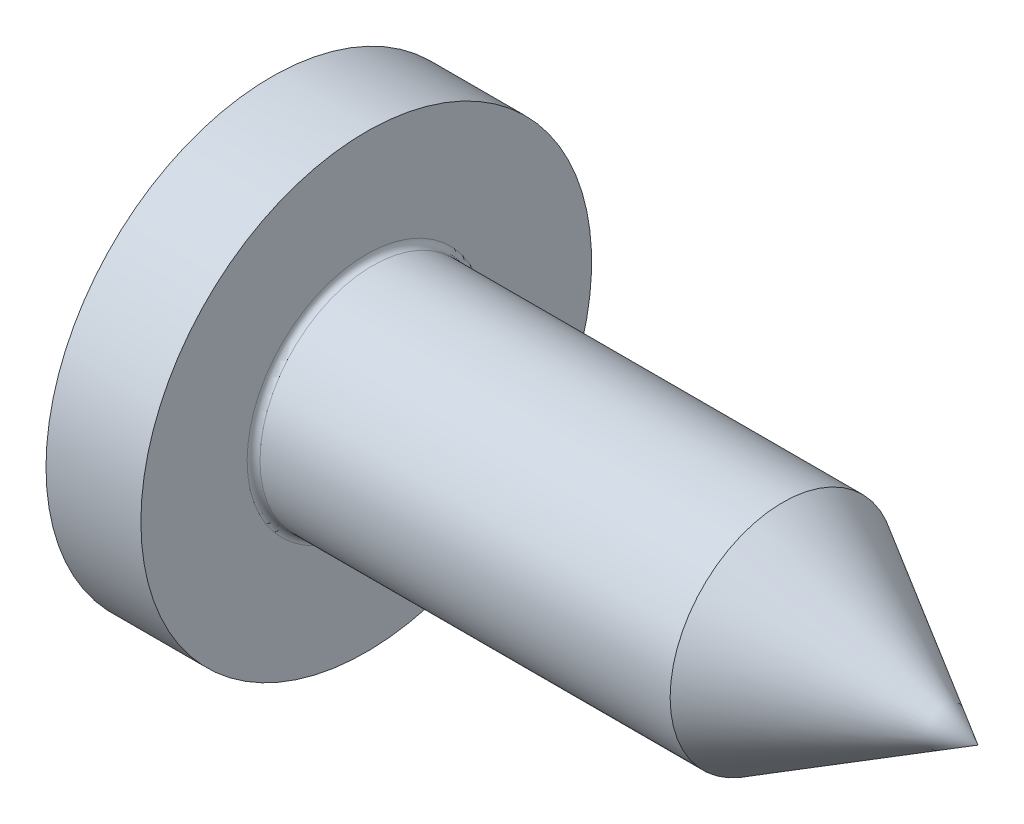
ISO-10303-21;
HEADER;
FILE_DESCRIPTION(('STEP AP214'),'2;1');
FILE_NAME('part.step','',(''),(''),'','','');
FILE_SCHEMA(('AUTOMOTIVE_DESIGN { 1 0 10303 214 1 1 1 1 }'));
ENDSEC;
DATA;
#1=APPLICATION_CONTEXT('core data for automotive mechanical design processes');
#2=APPLICATION_PROTOCOL_DEFINITION('international standard','automotive_design',2000,#1);
#3=PRODUCT_CONTEXT('',#1,'mechanical');
#4=PRODUCT('Part','Part','',(#3));
#5=PRODUCT_RELATED_PRODUCT_CATEGORY('part','',(#4));
#6=PRODUCT_DEFINITION_FORMATION('','',#4);
#7=PRODUCT_DEFINITION_CONTEXT('part definition',#1,'design');
#8=PRODUCT_DEFINITION('design','',#6,#7);
#9=PRODUCT_DEFINITION_SHAPE('','',#8);
#10=(LENGTH_UNIT() NAMED_UNIT(*) SI_UNIT(.MILLI.,.METRE.));
#11=(NAMED_UNIT(*) PLANE_ANGLE_UNIT() SI_UNIT($,.RADIAN.));
#12=(NAMED_UNIT(*) SI_UNIT($,.STERADIAN.) SOLID_ANGLE_UNIT());
#13=UNCERTAINTY_MEASURE_WITH_UNIT(LENGTH_MEASURE(1.E-05),#10,'distance_accuracy_value','');
#14=(GEOMETRIC_REPRESENTATION_CONTEXT(3) GLOBAL_UNCERTAINTY_ASSIGNED_CONTEXT((#13)) GLOBAL_UNIT_ASSIGNED_CONTEXT((#10,
#11,#12)) REPRESENTATION_CONTEXT('',''));
#15=CARTESIAN_POINT('',(0.,0.,0.));
#16=DIRECTION('',(0.,0.,1.));
#17=DIRECTION('',(1.,0.,0.));
#18=AXIS2_PLACEMENT_3D('',#15,#16,#17);
#19=CARTESIAN_POINT('',(3.4,0.,0.));
#20=DIRECTION('',(-1.,0.,0.));
#21=DIRECTION('',(0.,1.,0.));
#22=AXIS2_PLACEMENT_3D('',#19,#20,#21);
#23=SPHERICAL_SURFACE('',#22,6.);
#24=CARTESIAN_POINT('',(-1.47339717240448,0.,0.));
#25=DIRECTION('',(-1.,0.,0.));
#26=DIRECTION('',(0.,0.,1.));
#27=AXIS2_PLACEMENT_3D('',#24,#25,#26);
#28=CIRCLE('',#27,3.5);
#29=CARTESIAN_POINT('',(-1.47339717240448,0.,3.5));
#30=VERTEX_POINT('',#29);
#31=EDGE_CURVE('E197',#30,#30,#28,.T.);
#32=ORIENTED_EDGE('',*,*,#31,.T.);
#33=EDGE_LOOP('',(#32));
#34=FACE_BOUND('',#33,.T.);
#35=CARTESIAN_POINT('',(3.33444280220142,0.151277975654539,0.605111902618155));
#36=DIRECTION('',(0.104528463267654,-0.241206989505463,-0.964827958021851));
#37=DIRECTION('',(0.,0.970142500145332,-0.242535625036333));
#38=AXIS2_PLACEMENT_3D('',#35,#36,#37);
#39=CIRCLE('',#38,5.96713137220964);
#40=CARTESIAN_POINT('',(-2.26884904787776,1.91519463241969,-0.442922106386907));
#41=VERTEX_POINT('',#40);
#42=CARTESIAN_POINT('',(-2.47858837726631,1.16808862036956,-0.278868545434141));
#43=VERTEX_POINT('',#42);
#44=EDGE_CURVE('E330',#41,#43,#39,.F.);
#45=ORIENTED_EDGE('',*,*,#44,.F.);
#46=CARTESIAN_POINT('',(3.53715670074873,1.30495883826218,0.));
#47=DIRECTION('',(0.104528463267654,0.994521895368273,0.));
#48=DIRECTION('',(-0.994521895368273,0.104528463267654,0.));
#49=AXIS2_PLACEMENT_3D('',#46,#47,#48);
#50=CIRCLE('',#49,5.8547647664002);
#51=CARTESIAN_POINT('',(-2.26884904787776,1.91519463241969,0.442922106386907));
#52=VERTEX_POINT('',#51);
#53=EDGE_CURVE('E192',#52,#41,#50,.F.);
#54=ORIENTED_EDGE('',*,*,#53,.F.);
#55=CARTESIAN_POINT('',(3.33444280220142,0.151277975654539,-0.605111902618155));
#56=DIRECTION('',(0.104528463267654,-0.241206989505463,0.964827958021851));
#57=DIRECTION('',(0.,-0.970142500145332,-0.242535625036334));
#58=AXIS2_PLACEMENT_3D('',#55,#56,#57);
#59=CIRCLE('',#58,5.96713137220964);
#60=CARTESIAN_POINT('',(-2.47858837726631,1.16808862036956,0.27886854543414));
#61=VERTEX_POINT('',#60);
#62=EDGE_CURVE('E327',#61,#52,#59,.F.);
#63=ORIENTED_EDGE('',*,*,#62,.F.);
#64=CARTESIAN_POINT('',(3.42159027964193,0.10270889459097,0.1778970238208));
#65=DIRECTION('',(0.104528463267654,0.49726094768413,0.861281226008778));
#66=DIRECTION('',(0.,-0.866025403784442,0.499999999999993));
#67=AXIS2_PLACEMENT_3D('',#64,#65,#66);
#68=CIRCLE('',#67,5.9964437287206);
#69=CARTESIAN_POINT('',(-2.53788364639594,0.608907957684766,0.608907957684772));
#70=VERTEX_POINT('',#69);
#71=EDGE_CURVE('E325',#70,#61,#68,.F.);
#72=ORIENTED_EDGE('',*,*,#71,.F.);
#73=CARTESIAN_POINT('',(3.42159027964193,0.177897023820798,0.102708894590969));
#74=DIRECTION('',(0.104528463267654,0.861281226008778,0.49726094768413));
#75=DIRECTION('',(0.,-0.499999999999993,0.866025403784442));
#76=AXIS2_PLACEMENT_3D('',#73,#74,#75);
#77=CIRCLE('',#76,5.9964437287206);
#78=CARTESIAN_POINT('',(-2.47858837726631,0.278868545434134,1.16808862036956));
#79=VERTEX_POINT('',#78);
#80=EDGE_CURVE('E323',#79,#70,#77,.F.);
#81=ORIENTED_EDGE('',*,*,#80,.F.);
#82=CARTESIAN_POINT('',(3.33444280220142,-0.605111902618162,0.151277975654541));
#83=DIRECTION('',(0.104528463267654,0.964827958021851,-0.241206989505463));
#84=DIRECTION('',(0.,0.242535625036333,0.970142500145332));
#85=AXIS2_PLACEMENT_3D('',#82,#83,#84);
#86=CIRCLE('',#85,5.96713137220964);
#87=CARTESIAN_POINT('',(-2.26884904787776,0.442922106386901,1.9151946324197));
#88=VERTEX_POINT('',#87);
#89=EDGE_CURVE('E321',#88,#79,#86,.F.);
#90=ORIENTED_EDGE('',*,*,#89,.F.);
#91=CARTESIAN_POINT('',(3.53715670074873,0.,1.30495883826219));
#92=DIRECTION('',(0.104528463267654,0.,0.994521895368273));
#93=DIRECTION('',(0.994521895368273,0.,-0.104528463267654));
#94=AXIS2_PLACEMENT_3D('',#91,#92,#93);
#95=CIRCLE('',#94,5.8547647664002);
#96=CARTESIAN_POINT('',(-2.26884904787776,-0.442922106386913,1.9151946324197));
#97=VERTEX_POINT('',#96);
#98=EDGE_CURVE('E319',#97,#88,#95,.F.);
#99=ORIENTED_EDGE('',*,*,#98,.F.);
#100=CARTESIAN_POINT('',(3.33444280220142,0.605111902618151,0.151277975654538));
#101=DIRECTION('',(0.104528463267654,-0.964827958021851,-0.241206989505463));
#102=DIRECTION('',(0.,0.242535625036334,-0.970142500145332));
#103=AXIS2_PLACEMENT_3D('',#100,#101,#102);
#104=CIRCLE('',#103,5.96713137220964);
#105=CARTESIAN_POINT('',(-2.47858837726631,-0.278868545434147,1.16808862036956));
#106=VERTEX_POINT('',#105);
#107=EDGE_CURVE('E317',#106,#97,#104,.F.);
#108=ORIENTED_EDGE('',*,*,#107,.F.);
#109=CARTESIAN_POINT('',(3.42159027964194,-0.177897023820807,0.102708894590974));
#110=DIRECTION('',(0.104528463267654,-0.861281226008779,0.497260947684129));
#111=DIRECTION('',(0.,-0.499999999999992,-0.866025403784443));
#112=AXIS2_PLACEMENT_3D('',#109,#110,#111);
#113=CIRCLE('',#112,5.9964437287206);
#114=CARTESIAN_POINT('',(-2.53788364639594,-0.608907957684778,0.608907957684771));
#115=VERTEX_POINT('',#114);
#116=EDGE_CURVE('E315',#115,#106,#113,.F.);
#117=ORIENTED_EDGE('',*,*,#116,.F.);
#118=CARTESIAN_POINT('',(3.42159027964194,-0.102708894590973,0.177897023820804));
#119=DIRECTION('',(0.104528463267654,-0.497260947684129,0.861281226008779));
#120=DIRECTION('',(0.,-0.866025403784443,-0.499999999999992));
#121=AXIS2_PLACEMENT_3D('',#118,#119,#120);
#122=CIRCLE('',#121,5.9964437287206);
#123=CARTESIAN_POINT('',(-2.47858837726631,-1.16808862036957,0.27886854543414));
#124=VERTEX_POINT('',#123);
#125=EDGE_CURVE('E313',#124,#115,#122,.F.);
#126=ORIENTED_EDGE('',*,*,#125,.F.);
#127=CARTESIAN_POINT('',(3.33444280220142,-0.15127797565454,-0.605111902618158));
#128=DIRECTION('',(0.104528463267654,0.241206989505463,0.964827958021851));
#129=DIRECTION('',(0.,-0.970142500145332,0.242535625036333));
#130=AXIS2_PLACEMENT_3D('',#127,#128,#129);
#131=CIRCLE('',#130,5.96713137220964);
#132=CARTESIAN_POINT('',(-2.26884904787776,-1.9151946324197,0.442922106386907));
#133=VERTEX_POINT('',#132);
#134=EDGE_CURVE('E311',#133,#124,#131,.F.);
#135=ORIENTED_EDGE('',*,*,#134,.F.);
#136=CARTESIAN_POINT('',(3.53715670074873,-1.30495883826219,0.));
#137=DIRECTION('',(0.104528463267654,-0.994521895368273,0.));
#138=DIRECTION('',(0.994521895368273,0.104528463267654,0.));
#139=AXIS2_PLACEMENT_3D('',#136,#137,#138);
#140=CIRCLE('',#139,5.85476476640019);
#141=CARTESIAN_POINT('',(-2.26884904787775,-1.9151946324197,-0.442922106386907));
#142=VERTEX_POINT('',#141);
#143=EDGE_CURVE('E309',#142,#133,#140,.F.);
#144=ORIENTED_EDGE('',*,*,#143,.F.);
#145=CARTESIAN_POINT('',(3.33444280220142,-0.15127797565454,0.605111902618158));
#146=DIRECTION('',(0.104528463267654,0.241206989505463,-0.964827958021851));
#147=DIRECTION('',(0.,0.970142500145332,0.242535625036334));
#148=AXIS2_PLACEMENT_3D('',#145,#146,#147);
#149=CIRCLE('',#148,5.96713137220964);
#150=CARTESIAN_POINT('',(-2.47858837726631,-1.16808862036957,-0.27886854543414));
#151=VERTEX_POINT('',#150);
#152=EDGE_CURVE('E307',#151,#142,#149,.F.);
#153=ORIENTED_EDGE('',*,*,#152,.F.);
#154=CARTESIAN_POINT('',(3.42159027964194,-0.102708894590973,-0.177897023820805));
#155=DIRECTION('',(0.104528463267654,-0.49726094768413,-0.861281226008778));
#156=DIRECTION('',(0.,0.866025403784442,-0.499999999999993));
#157=AXIS2_PLACEMENT_3D('',#154,#155,#156);
#158=CIRCLE('',#157,5.9964437287206);
#159=CARTESIAN_POINT('',(-2.53788364639594,-0.608907957684778,-0.608907957684772));
#160=VERTEX_POINT('',#159);
#161=EDGE_CURVE('E305',#160,#151,#158,.F.);
#162=ORIENTED_EDGE('',*,*,#161,.F.);
#163=CARTESIAN_POINT('',(3.42159027964194,-0.177897023820807,-0.102708894590974));
#164=DIRECTION('',(0.104528463267654,-0.861281226008778,-0.49726094768413));
#165=DIRECTION('',(0.,0.499999999999993,-0.866025403784443));
#166=AXIS2_PLACEMENT_3D('',#163,#164,#165);
#167=CIRCLE('',#166,5.9964437287206);
#168=CARTESIAN_POINT('',(-2.47858837726631,-0.278868545434147,-1.16808862036956));
#169=VERTEX_POINT('',#168);
#170=EDGE_CURVE('E303',#169,#160,#167,.F.);
#171=ORIENTED_EDGE('',*,*,#170,.F.);
#172=CARTESIAN_POINT('',(3.33444280220142,0.60511190261815,-0.151277975654538));
#173=DIRECTION('',(0.104528463267654,-0.964827958021851,0.241206989505463));
#174=DIRECTION('',(0.,-0.242535625036333,-0.970142500145332));
#175=AXIS2_PLACEMENT_3D('',#172,#173,#174);
#176=CIRCLE('',#175,5.96713137220964);
#177=CARTESIAN_POINT('',(-2.26884904787776,-0.442922106386913,-1.9151946324197));
#178=VERTEX_POINT('',#177);
#179=EDGE_CURVE('E301',#178,#169,#176,.F.);
#180=ORIENTED_EDGE('',*,*,#179,.F.);
#181=CARTESIAN_POINT('',(3.53715670074873,0.,-1.30495883826219));
#182=DIRECTION('',(0.104528463267654,0.,-0.994521895368273));
#183=DIRECTION('',(-0.994521895368273,0.,-0.104528463267654));
#184=AXIS2_PLACEMENT_3D('',#181,#182,#183);
#185=CIRCLE('',#184,5.8547647664002);
#186=CARTESIAN_POINT('',(-2.26884904787776,0.442922106386901,-1.9151946324197));
#187=VERTEX_POINT('',#186);
#188=EDGE_CURVE('E299',#187,#178,#185,.F.);
#189=ORIENTED_EDGE('',*,*,#188,.F.);
#190=CARTESIAN_POINT('',(3.33444280220142,-0.605111902618163,-0.151277975654541));
#191=DIRECTION('',(0.104528463267654,0.964827958021851,0.241206989505463));
#192=DIRECTION('',(0.,-0.242535625036334,0.970142500145332));
#193=AXIS2_PLACEMENT_3D('',#190,#191,#192);
#194=CIRCLE('',#193,5.96713137220964);
#195=CARTESIAN_POINT('',(-2.47858837726631,0.278868545434134,-1.16808862036956));
#196=VERTEX_POINT('',#195);
#197=EDGE_CURVE('E297',#196,#187,#194,.F.);
#198=ORIENTED_EDGE('',*,*,#197,.F.);
#199=CARTESIAN_POINT('',(3.42159027964193,0.177897023820798,-0.102708894590969));
#200=DIRECTION('',(0.104528463267654,0.861281226008778,-0.49726094768413));
#201=DIRECTION('',(0.,0.499999999999993,0.866025403784442));
#202=AXIS2_PLACEMENT_3D('',#199,#200,#201);
#203=CIRCLE('',#202,5.9964437287206);
#204=CARTESIAN_POINT('',(-2.53788364639594,0.608907957684766,-0.608907957684772));
#205=VERTEX_POINT('',#204);
#206=EDGE_CURVE('E295',#205,#196,#203,.F.);
#207=ORIENTED_EDGE('',*,*,#206,.F.);
#208=CARTESIAN_POINT('',(3.42159027964193,0.10270889459097,-0.1778970238208));
#209=DIRECTION('',(0.104528463267654,0.49726094768413,-0.861281226008778));
#210=DIRECTION('',(0.,0.866025403784443,0.499999999999993));
#211=AXIS2_PLACEMENT_3D('',#208,#209,#210);
#212=CIRCLE('',#211,5.9964437287206);
#213=EDGE_CURVE('E293',#43,#205,#212,.F.);
#214=ORIENTED_EDGE('',*,*,#213,.F.);
#215=EDGE_LOOP('',(#45,#54,#63,#72,#81,#90,#99,#108,#117,#126,#135,#144,#153,#162,#171,#180,
#189,#198,#207,#214));
#216=FACE_BOUND('',#215,.T.);
#217=ADVANCED_FACE('F35',(#34,#216),#23,.T.);
#218=CARTESIAN_POINT('',(0.,0.,0.));
#219=DIRECTION('',(-1.,0.,0.));
#220=DIRECTION('',(0.,0.,1.));
#221=AXIS2_PLACEMENT_3D('',#218,#219,#220);
#222=CYLINDRICAL_SURFACE('',#221,1.75);
#223=CARTESIAN_POINT('',(0.1,0.,0.));
#224=DIRECTION('',(-1.,0.,0.));
#225=DIRECTION('',(0.,0.,1.));
#226=AXIS2_PLACEMENT_3D('',#223,#224,#225);
#227=CIRCLE('',#226,1.75);
#228=CARTESIAN_POINT('',(0.1,0.,1.75));
#229=VERTEX_POINT('',#228);
#230=EDGE_CURVE('E11',#229,#229,#227,.F.);
#231=ORIENTED_EDGE('',*,*,#230,.T.);
#232=EDGE_LOOP('',(#231));
#233=FACE_BOUND('',#232,.T.);
#234=CARTESIAN_POINT('',(6.46891108675442,0.,0.));
#235=DIRECTION('',(-1.,0.,0.));
#236=DIRECTION('',(0.,0.,1.));
#237=AXIS2_PLACEMENT_3D('',#234,#235,#236);
#238=CIRCLE('',#237,1.75);
#239=CARTESIAN_POINT('',(6.46891108675442,0.,1.75));
#240=VERTEX_POINT('',#239);
#241=EDGE_CURVE('E193',#240,#240,#238,.T.);
#242=ORIENTED_EDGE('',*,*,#241,.T.);
#243=EDGE_LOOP('',(#242));
#244=FACE_BOUND('',#243,.T.);
#245=ADVANCED_FACE('F346',(#233,#244),#222,.T.);
#246=CARTESIAN_POINT('',(0.,1.75,0.));
#247=DIRECTION('',(-1.,0.,0.));
#248=DIRECTION('',(0.,0.,1.));
#249=AXIS2_PLACEMENT_3D('',#246,#247,#248);
#250=PLANE('',#249);
#251=CARTESIAN_POINT('',(0.,0.,0.));
#252=DIRECTION('',(-1.,0.,0.));
#253=DIRECTION('',(0.,0.,1.));
#254=AXIS2_PLACEMENT_3D('',#251,#252,#253);
#255=CIRCLE('',#254,1.85);
#256=CARTESIAN_POINT('',(0.,0.,1.85));
#257=VERTEX_POINT('',#256);
#258=EDGE_CURVE('E43',#257,#257,#255,.T.);
#259=ORIENTED_EDGE('',*,*,#258,.T.);
#260=EDGE_LOOP('',(#259));
#261=FACE_BOUND('',#260,.T.);
#262=CARTESIAN_POINT('',(0.,0.,0.));
#263=DIRECTION('',(-1.,0.,0.));
#264=DIRECTION('',(0.,0.,1.));
#265=AXIS2_PLACEMENT_3D('',#262,#263,#264);
#266=CIRCLE('',#265,3.5);
#267=CARTESIAN_POINT('',(0.,0.,3.5));
#268=VERTEX_POINT('',#267);
#269=EDGE_CURVE('E290',#268,#268,#266,.T.);
#270=ORIENTED_EDGE('',*,*,#269,.F.);
#271=EDGE_LOOP('',(#270));
#272=FACE_BOUND('',#271,.T.);
#273=ADVANCED_FACE('F334',(#261,#272),#250,.F.);
#274=CARTESIAN_POINT('',(0.,0.,0.));
#275=DIRECTION('',(-1.,0.,0.));
#276=DIRECTION('',(0.,0.,1.));
#277=AXIS2_PLACEMENT_3D('',#274,#275,#276);
#278=CYLINDRICAL_SURFACE('',#277,3.5);
#279=ORIENTED_EDGE('',*,*,#31,.F.);
#280=EDGE_LOOP('',(#279));
#281=FACE_BOUND('',#280,.T.);
#282=ORIENTED_EDGE('',*,*,#269,.T.);
#283=EDGE_LOOP('',(#282));
#284=FACE_BOUND('',#283,.T.);
#285=ADVANCED_FACE('F357',(#281,#284),#278,.T.);
#286=CARTESIAN_POINT('',(6.46891108675442,0.,0.));
#287=DIRECTION('',(-1.,0.,0.));
#288=DIRECTION('',(0.,0.,1.));
#289=AXIS2_PLACEMENT_3D('',#286,#287,#288);
#290=CONICAL_SURFACE('',#289,1.75,0.523598775598293);
#291=CARTESIAN_POINT('',(9.5,0.,0.));
#292=VERTEX_POINT('',#291);
#293=VERTEX_LOOP('',#292);
#294=FACE_BOUND('',#293,.T.);
#295=ORIENTED_EDGE('',*,*,#241,.F.);
#296=EDGE_LOOP('',(#295));
#297=FACE_BOUND('',#296,.T.);
#298=ADVANCED_FACE('F359',(#294,#297),#290,.T.);
#299=CARTESIAN_POINT('',(-2.6,1.95,-0.4875));
#300=DIRECTION('',(0.104528463267654,-0.241206989505463,-0.964827958021851));
#301=DIRECTION('',(0.,0.970142500145332,-0.242535625036333));
#302=AXIS2_PLACEMENT_3D('',#299,#300,#301);
#303=PLANE('',#302);
#304=ORIENTED_EDGE('',*,*,#44,.T.);
#305=DIRECTION('',(-0.993634572314886,0.0156427600493606,-0.111560032084303));
#306=VECTOR('',#305,1.);
#307=CARTESIAN_POINT('',(-2.6,1.17,-0.2925));
#308=LINE('',#307,#306);
#309=CARTESIAN_POINT('',(-1.2,1.14795984089192,-0.135315407927927));
#310=VERTEX_POINT('',#309);
#311=EDGE_CURVE('E50',#310,#43,#308,.T.);
#312=ORIENTED_EDGE('',*,*,#311,.F.);
#313=DIRECTION('',(0.,-0.970142500145332,0.242535625036333));
#314=VECTOR('',#313,1.);
#315=CARTESIAN_POINT('',(-1.2,0.0356881299517736,0.142752519807111));
#316=LINE('',#315,#314);
#317=CARTESIAN_POINT('',(-1.2,1.80285407062805,-0.299038965361959));
#318=VERTEX_POINT('',#317);
#319=EDGE_CURVE('E176',#310,#318,#316,.F.);
#320=ORIENTED_EDGE('',*,*,#319,.T.);
#321=DIRECTION('',(-0.985727427293418,0.103604127426078,-0.132693722013437));
#322=VECTOR('',#321,1.);
#323=CARTESIAN_POINT('',(-2.47247015481216,1.93659607314798,-0.470332566734765));
#324=LINE('',#323,#322);
#325=EDGE_CURVE('E187',#318,#41,#324,.T.);
#326=ORIENTED_EDGE('',*,*,#325,.T.);
#327=EDGE_LOOP('',(#304,#312,#320,#326));
#328=FACE_BOUND('',#327,.T.);
#329=ADVANCED_FACE('F186',(#328),#303,.F.);
#330=CARTESIAN_POINT('',(-2.6,1.95,0.4875));
#331=DIRECTION('',(0.104528463267654,0.994521895368273,0.));
#332=DIRECTION('',(-0.994521895368273,0.104528463267654,0.));
#333=AXIS2_PLACEMENT_3D('',#330,#331,#332);
#334=PLANE('',#333);
#335=ORIENTED_EDGE('',*,*,#53,.T.);
#336=ORIENTED_EDGE('',*,*,#325,.F.);
#337=DIRECTION('',(0.,0.,-1.));
#338=VECTOR('',#337,1.);
#339=CARTESIAN_POINT('',(-1.2,1.80285407062805,0.));
#340=LINE('',#339,#338);
#341=CARTESIAN_POINT('',(-1.2,1.80285407062805,0.299038965361959));
#342=VERTEX_POINT('',#341);
#343=EDGE_CURVE('E172',#318,#342,#340,.F.);
#344=ORIENTED_EDGE('',*,*,#343,.T.);
#345=DIRECTION('',(-0.985727427293418,0.103604127426078,0.132693722013437));
#346=VECTOR('',#345,1.);
#347=CARTESIAN_POINT('',(-2.6,1.95,0.4875));
#348=LINE('',#347,#346);
#349=EDGE_CURVE('E194',#342,#52,#348,.T.);
#350=ORIENTED_EDGE('',*,*,#349,.T.);
#351=EDGE_LOOP('',(#335,#336,#344,#350));
#352=FACE_BOUND('',#351,.T.);
#353=ADVANCED_FACE('F190',(#352),#334,.F.);
#354=CARTESIAN_POINT('',(-2.6,1.95,0.4875));
#355=DIRECTION('',(0.104528463267654,-0.241206989505463,0.964827958021851));
#356=DIRECTION('',(0.,-0.970142500145332,-0.242535625036334));
#357=AXIS2_PLACEMENT_3D('',#354,#355,#356);
#358=PLANE('',#357);
#359=ORIENTED_EDGE('',*,*,#62,.T.);
#360=ORIENTED_EDGE('',*,*,#349,.F.);
#361=DIRECTION('',(0.,0.970142500145332,0.242535625036334));
#362=VECTOR('',#361,1.);
#363=CARTESIAN_POINT('',(-1.2,0.0356881299517744,-0.142752519807111));
#364=LINE('',#363,#362);
#365=CARTESIAN_POINT('',(-1.2,1.14795984089192,0.135315407927927));
#366=VERTEX_POINT('',#365);
#367=EDGE_CURVE('E178',#342,#366,#364,.F.);
#368=ORIENTED_EDGE('',*,*,#367,.T.);
#369=DIRECTION('',(-0.993634572314886,0.0156427600493606,0.111560032084303));
#370=VECTOR('',#369,1.);
#371=CARTESIAN_POINT('',(-2.63373941743901,1.17053115866326,0.296288083262071));
#372=LINE('',#371,#370);
#373=EDGE_CURVE('E199',#366,#61,#372,.T.);
#374=ORIENTED_EDGE('',*,*,#373,.T.);
#375=EDGE_LOOP('',(#359,#360,#368,#374));
#376=FACE_BOUND('',#375,.T.);
#377=ADVANCED_FACE('F387',(#376),#358,.F.);
#378=CARTESIAN_POINT('',(-2.6,1.17,0.292499999999999));
#379=DIRECTION('',(0.104528463267654,0.49726094768413,0.861281226008778));
#380=DIRECTION('',(0.,-0.866025403784442,0.499999999999993));
#381=AXIS2_PLACEMENT_3D('',#378,#379,#380);
#382=PLANE('',#381);
#383=ORIENTED_EDGE('',*,*,#71,.T.);
#384=ORIENTED_EDGE('',*,*,#373,.F.);
#385=DIRECTION('',(0.,0.866025403784442,-0.499999999999993));
#386=VECTOR('',#385,1.);
#387=CARTESIAN_POINT('',(-1.2,0.345583250617489,0.598567748314318));
#388=LINE('',#387,#386);
#389=CARTESIAN_POINT('',(-1.2,0.50596899539363,0.505968995393636));
#390=VERTEX_POINT('',#389);
#391=EDGE_CURVE('E255',#366,#390,#388,.F.);
#392=ORIENTED_EDGE('',*,*,#391,.T.);
#393=DIRECTION('',(-0.994132040497618,0.0764901498757906,0.0764901498757906));
#394=VECTOR('',#393,1.);
#395=CARTESIAN_POINT('',(-2.61787924438592,0.615062950211306,0.615062950211312));
#396=LINE('',#395,#394);
#397=EDGE_CURVE('E249',#390,#70,#396,.T.);
#398=ORIENTED_EDGE('',*,*,#397,.T.);
#399=EDGE_LOOP('',(#383,#384,#392,#398));
#400=FACE_BOUND('',#399,.T.);
#401=ADVANCED_FACE('F394',(#400),#382,.F.);
#402=CARTESIAN_POINT('',(-2.6,0.292499999999993,1.17000000000001));
#403=DIRECTION('',(0.104528463267654,0.861281226008778,0.49726094768413));
#404=DIRECTION('',(0.,-0.499999999999993,0.866025403784442));
#405=AXIS2_PLACEMENT_3D('',#402,#403,#404);
#406=PLANE('',#405);
#407=ORIENTED_EDGE('',*,*,#80,.T.);
#408=ORIENTED_EDGE('',*,*,#397,.F.);
#409=DIRECTION('',(0.,0.499999999999993,-0.866025403784442));
#410=VECTOR('',#409,1.);
#411=CARTESIAN_POINT('',(-1.2,0.598567748314312,0.345583250617494));
#412=LINE('',#411,#410);
#413=CARTESIAN_POINT('',(-1.2,0.135315407927921,1.14795984089193));
#414=VERTEX_POINT('',#413);
#415=EDGE_CURVE('E257',#390,#414,#412,.F.);
#416=ORIENTED_EDGE('',*,*,#415,.T.);
#417=DIRECTION('',(-0.993634572314886,0.111560032084303,0.0156427600493606));
#418=VECTOR('',#417,1.);
#419=CARTESIAN_POINT('',(-2.6,0.292499999999993,1.17000000000001));
#420=LINE('',#419,#418);
#421=EDGE_CURVE('E246',#414,#79,#420,.T.);
#422=ORIENTED_EDGE('',*,*,#421,.T.);
#423=EDGE_LOOP('',(#407,#408,#416,#422));
#424=FACE_BOUND('',#423,.T.);
#425=ADVANCED_FACE('F402',(#424),#406,.F.);
#426=CARTESIAN_POINT('',(-2.6,0.487499999999993,1.95000000000001));
#427=DIRECTION('',(0.104528463267654,0.964827958021851,-0.241206989505463));
#428=DIRECTION('',(0.,0.242535625036333,0.970142500145332));
#429=AXIS2_PLACEMENT_3D('',#426,#427,#428);
#430=PLANE('',#429);
#431=ORIENTED_EDGE('',*,*,#89,.T.);
#432=ORIENTED_EDGE('',*,*,#421,.F.);
#433=DIRECTION('',(0.,-0.242535625036333,-0.970142500145332));
#434=VECTOR('',#433,1.);
#435=CARTESIAN_POINT('',(-1.2,-0.142752519807117,0.0356881299517797));
#436=LINE('',#435,#434);
#437=CARTESIAN_POINT('',(-1.2,0.299038965361953,1.80285407062806));
#438=VERTEX_POINT('',#437);
#439=EDGE_CURVE('E259',#414,#438,#436,.F.);
#440=ORIENTED_EDGE('',*,*,#439,.T.);
#441=DIRECTION('',(-0.985727427293418,0.132693722013437,0.103604127426078));
#442=VECTOR('',#441,1.);
#443=CARTESIAN_POINT('',(-2.47247015481216,0.470332566734759,1.93659607314799));
#444=LINE('',#443,#442);
#445=EDGE_CURVE('E243',#438,#88,#444,.T.);
#446=ORIENTED_EDGE('',*,*,#445,.T.);
#447=EDGE_LOOP('',(#431,#432,#440,#446));
#448=FACE_BOUND('',#447,.T.);
#449=ADVANCED_FACE('F410',(#448),#430,.F.);
#450=CARTESIAN_POINT('',(-2.6,-0.487500000000006,1.95000000000001));
#451=DIRECTION('',(0.104528463267654,0.,0.994521895368273));
#452=DIRECTION('',(0.994521895368273,0.,-0.104528463267654));
#453=AXIS2_PLACEMENT_3D('',#450,#451,#452);
#454=PLANE('',#453);
#455=ORIENTED_EDGE('',*,*,#98,.T.);
#456=ORIENTED_EDGE('',*,*,#445,.F.);
#457=DIRECTION('',(0.,1.,0.));
#458=VECTOR('',#457,1.);
#459=CARTESIAN_POINT('',(-1.2,0.,1.80285407062806));
#460=LINE('',#459,#458);
#461=CARTESIAN_POINT('',(-1.2,-0.299038965361966,1.80285407062806));
#462=VERTEX_POINT('',#461);
#463=EDGE_CURVE('E261',#438,#462,#460,.F.);
#464=ORIENTED_EDGE('',*,*,#463,.T.);
#465=DIRECTION('',(-0.985727427293418,-0.132693722013437,0.103604127426078));
#466=VECTOR('',#465,1.);
#467=CARTESIAN_POINT('',(-2.6,-0.487500000000006,1.95000000000001));
#468=LINE('',#467,#466);
#469=EDGE_CURVE('E240',#462,#97,#468,.T.);
#470=ORIENTED_EDGE('',*,*,#469,.T.);
#471=EDGE_LOOP('',(#455,#456,#464,#470));
#472=FACE_BOUND('',#471,.T.);
#473=ADVANCED_FACE('F418',(#472),#454,.F.);
#474=CARTESIAN_POINT('',(-2.6,-0.487500000000006,1.95000000000001));
#475=DIRECTION('',(0.104528463267654,-0.964827958021851,-0.241206989505463));
#476=DIRECTION('',(0.,0.242535625036334,-0.970142500145332));
#477=AXIS2_PLACEMENT_3D('',#474,#475,#476);
#478=PLANE('',#477);
#479=ORIENTED_EDGE('',*,*,#107,.T.);
#480=ORIENTED_EDGE('',*,*,#469,.F.);
#481=DIRECTION('',(0.,-0.242535625036334,0.970142500145332));
#482=VECTOR('',#481,1.);
#483=CARTESIAN_POINT('',(-1.2,0.142752519807106,0.0356881299517788));
#484=LINE('',#483,#482);
#485=CARTESIAN_POINT('',(-1.2,-0.135315407927933,1.14795984089193));
#486=VERTEX_POINT('',#485);
#487=EDGE_CURVE('E263',#462,#486,#484,.F.);
#488=ORIENTED_EDGE('',*,*,#487,.T.);
#489=DIRECTION('',(-0.993634572314887,-0.111560032084303,0.0156427600493605));
#490=VECTOR('',#489,1.);
#491=CARTESIAN_POINT('',(-2.63373941743901,-0.296288083262078,1.17053115866327));
#492=LINE('',#491,#490);
#493=EDGE_CURVE('E237',#486,#106,#492,.T.);
#494=ORIENTED_EDGE('',*,*,#493,.T.);
#495=EDGE_LOOP('',(#479,#480,#488,#494));
#496=FACE_BOUND('',#495,.T.);
#497=ADVANCED_FACE('F426',(#496),#478,.F.);
#498=CARTESIAN_POINT('',(-2.6,-0.292500000000006,1.17000000000001));
#499=DIRECTION('',(0.104528463267654,-0.861281226008779,0.497260947684129));
#500=DIRECTION('',(0.,-0.499999999999992,-0.866025403784443));
#501=AXIS2_PLACEMENT_3D('',#498,#499,#500);
#502=PLANE('',#501);
#503=ORIENTED_EDGE('',*,*,#116,.T.);
#504=ORIENTED_EDGE('',*,*,#493,.F.);
#505=DIRECTION('',(0.,0.499999999999992,0.866025403784443));
#506=VECTOR('',#505,1.);
#507=CARTESIAN_POINT('',(-1.2,-0.598567748314323,0.345583250617494));
#508=LINE('',#507,#506);
#509=CARTESIAN_POINT('',(-1.2,-0.505968995393641,0.505968995393635));
#510=VERTEX_POINT('',#509);
#511=EDGE_CURVE('E265',#486,#510,#508,.F.);
#512=ORIENTED_EDGE('',*,*,#511,.T.);
#513=DIRECTION('',(-0.994132040497618,-0.0764901498757906,0.0764901498757907));
#514=VECTOR('',#513,1.);
#515=CARTESIAN_POINT('',(-2.61787924438592,-0.615062950211318,0.615062950211311));
#516=LINE('',#515,#514);
#517=EDGE_CURVE('E234',#510,#115,#516,.T.);
#518=ORIENTED_EDGE('',*,*,#517,.T.);
#519=EDGE_LOOP('',(#503,#504,#512,#518));
#520=FACE_BOUND('',#519,.T.);
#521=ADVANCED_FACE('F434',(#520),#502,.F.);
#522=CARTESIAN_POINT('',(-2.6,-1.17000000000001,0.2925));
#523=DIRECTION('',(0.104528463267654,-0.497260947684129,0.861281226008779));
#524=DIRECTION('',(0.,-0.866025403784443,-0.499999999999992));
#525=AXIS2_PLACEMENT_3D('',#522,#523,#524);
#526=PLANE('',#525);
#527=ORIENTED_EDGE('',*,*,#125,.T.);
#528=ORIENTED_EDGE('',*,*,#517,.F.);
#529=DIRECTION('',(0.,0.866025403784443,0.499999999999992));
#530=VECTOR('',#529,1.);
#531=CARTESIAN_POINT('',(-1.2,-0.345583250617496,0.598567748314319));
#532=LINE('',#531,#530);
#533=CARTESIAN_POINT('',(-1.2,-1.14795984089194,0.135315407927927));
#534=VERTEX_POINT('',#533);
#535=EDGE_CURVE('E267',#510,#534,#532,.F.);
#536=ORIENTED_EDGE('',*,*,#535,.T.);
#537=DIRECTION('',(-0.993634572314886,-0.0156427600493606,0.111560032084303));
#538=VECTOR('',#537,1.);
#539=CARTESIAN_POINT('',(-2.6,-1.17000000000001,0.2925));
#540=LINE('',#539,#538);
#541=EDGE_CURVE('E231',#534,#124,#540,.T.);
#542=ORIENTED_EDGE('',*,*,#541,.T.);
#543=EDGE_LOOP('',(#527,#528,#536,#542));
#544=FACE_BOUND('',#543,.T.);
#545=ADVANCED_FACE('F442',(#544),#526,.F.);
#546=CARTESIAN_POINT('',(-2.6,-1.95000000000001,0.4875));
#547=DIRECTION('',(0.104528463267654,0.241206989505463,0.964827958021851));
#548=DIRECTION('',(0.,-0.970142500145332,0.242535625036333));
#549=AXIS2_PLACEMENT_3D('',#546,#547,#548);
#550=PLANE('',#549);
#551=ORIENTED_EDGE('',*,*,#134,.T.);
#552=ORIENTED_EDGE('',*,*,#541,.F.);
#553=DIRECTION('',(0.,0.970142500145332,-0.242535625036333));
#554=VECTOR('',#553,1.);
#555=CARTESIAN_POINT('',(-1.2,-0.0356881299517822,-0.142752519807112));
#556=LINE('',#555,#554);
#557=CARTESIAN_POINT('',(-1.2,-1.80285407062806,0.299038965361959));
#558=VERTEX_POINT('',#557);
#559=EDGE_CURVE('E269',#534,#558,#556,.F.);
#560=ORIENTED_EDGE('',*,*,#559,.T.);
#561=DIRECTION('',(-0.985727427293419,-0.103604127426078,0.132693722013437));
#562=VECTOR('',#561,1.);
#563=CARTESIAN_POINT('',(-2.47247015481216,-1.93659607314799,0.470332566734765));
#564=LINE('',#563,#562);
#565=EDGE_CURVE('E228',#558,#133,#564,.T.);
#566=ORIENTED_EDGE('',*,*,#565,.T.);
#567=EDGE_LOOP('',(#551,#552,#560,#566));
#568=FACE_BOUND('',#567,.T.);
#569=ADVANCED_FACE('F450',(#568),#550,.F.);
#570=CARTESIAN_POINT('',(-2.6,-1.95000000000001,-0.4875));
#571=DIRECTION('',(0.104528463267654,-0.994521895368273,0.));
#572=DIRECTION('',(0.994521895368273,0.104528463267654,0.));
#573=AXIS2_PLACEMENT_3D('',#570,#571,#572);
#574=PLANE('',#573);
#575=ORIENTED_EDGE('',*,*,#143,.T.);
#576=ORIENTED_EDGE('',*,*,#565,.F.);
#577=DIRECTION('',(0.,0.,1.));
#578=VECTOR('',#577,1.);
#579=CARTESIAN_POINT('',(-1.2,-1.80285407062806,0.));
#580=LINE('',#579,#578);
#581=CARTESIAN_POINT('',(-1.2,-1.80285407062806,-0.299038965361959));
#582=VERTEX_POINT('',#581);
#583=EDGE_CURVE('E271',#558,#582,#580,.F.);
#584=ORIENTED_EDGE('',*,*,#583,.T.);
#585=DIRECTION('',(-0.985727427293418,-0.103604127426078,-0.132693722013437));
#586=VECTOR('',#585,1.);
#587=CARTESIAN_POINT('',(-2.6,-1.95000000000001,-0.4875));
#588=LINE('',#587,#586);
#589=EDGE_CURVE('E225',#582,#142,#588,.T.);
#590=ORIENTED_EDGE('',*,*,#589,.T.);
#591=EDGE_LOOP('',(#575,#576,#584,#590));
#592=FACE_BOUND('',#591,.T.);
#593=ADVANCED_FACE('F458',(#592),#574,.F.);
#594=CARTESIAN_POINT('',(-2.6,-1.95000000000001,-0.4875));
#595=DIRECTION('',(0.104528463267654,0.241206989505463,-0.964827958021851));
#596=DIRECTION('',(0.,0.970142500145332,0.242535625036334));
#597=AXIS2_PLACEMENT_3D('',#594,#595,#596);
#598=PLANE('',#597);
#599=ORIENTED_EDGE('',*,*,#152,.T.);
#600=ORIENTED_EDGE('',*,*,#589,.F.);
#601=DIRECTION('',(0.,-0.970142500145332,-0.242535625036334));
#602=VECTOR('',#601,1.);
#603=CARTESIAN_POINT('',(-1.2,-0.0356881299517818,0.142752519807113));
#604=LINE('',#603,#602);
#605=CARTESIAN_POINT('',(-1.2,-1.14795984089194,-0.135315407927927));
#606=VERTEX_POINT('',#605);
#607=EDGE_CURVE('E273',#582,#606,#604,.F.);
#608=ORIENTED_EDGE('',*,*,#607,.T.);
#609=DIRECTION('',(-0.993634572314886,-0.0156427600493606,-0.111560032084303));
#610=VECTOR('',#609,1.);
#611=CARTESIAN_POINT('',(-2.63373941743901,-1.17053115866328,-0.296288083262072));
#612=LINE('',#611,#610);
#613=EDGE_CURVE('E222',#606,#151,#612,.T.);
#614=ORIENTED_EDGE('',*,*,#613,.T.);
#615=EDGE_LOOP('',(#599,#600,#608,#614));
#616=FACE_BOUND('',#615,.T.);
#617=ADVANCED_FACE('F466',(#616),#598,.F.);
#618=CARTESIAN_POINT('',(-2.6,-1.17000000000001,-0.2925));
#619=DIRECTION('',(0.104528463267654,-0.49726094768413,-0.861281226008778));
#620=DIRECTION('',(0.,0.866025403784442,-0.499999999999993));
#621=AXIS2_PLACEMENT_3D('',#618,#619,#620);
#622=PLANE('',#621);
#623=ORIENTED_EDGE('',*,*,#161,.T.);
#624=ORIENTED_EDGE('',*,*,#613,.F.);
#625=DIRECTION('',(0.,-0.866025403784442,0.499999999999993));
#626=VECTOR('',#625,1.);
#627=CARTESIAN_POINT('',(-1.2,-0.345583250617499,-0.598567748314319));
#628=LINE('',#627,#626);
#629=CARTESIAN_POINT('',(-1.2,-0.505968995393642,-0.505968995393636));
#630=VERTEX_POINT('',#629);
#631=EDGE_CURVE('E275',#606,#630,#628,.F.);
#632=ORIENTED_EDGE('',*,*,#631,.T.);
#633=DIRECTION('',(-0.994132040497618,-0.0764901498757907,-0.0764901498757906));
#634=VECTOR('',#633,1.);
#635=CARTESIAN_POINT('',(-2.61787924438592,-0.615062950211319,-0.615062950211312));
#636=LINE('',#635,#634);
#637=EDGE_CURVE('E219',#630,#160,#636,.T.);
#638=ORIENTED_EDGE('',*,*,#637,.T.);
#639=EDGE_LOOP('',(#623,#624,#632,#638));
#640=FACE_BOUND('',#639,.T.);
#641=ADVANCED_FACE('F474',(#640),#622,.F.);
#642=CARTESIAN_POINT('',(-2.6,-0.292500000000006,-1.17000000000001));
#643=DIRECTION('',(0.104528463267654,-0.861281226008778,-0.49726094768413));
#644=DIRECTION('',(0.,0.499999999999993,-0.866025403784443));
#645=AXIS2_PLACEMENT_3D('',#642,#643,#644);
#646=PLANE('',#645);
#647=ORIENTED_EDGE('',*,*,#170,.T.);
#648=ORIENTED_EDGE('',*,*,#637,.F.);
#649=DIRECTION('',(0.,-0.499999999999993,0.866025403784443));
#650=VECTOR('',#649,1.);
#651=CARTESIAN_POINT('',(-1.2,-0.598567748314325,-0.345583250617494));
#652=LINE('',#651,#650);
#653=CARTESIAN_POINT('',(-1.2,-0.135315407927933,-1.14795984089193));
#654=VERTEX_POINT('',#653);
#655=EDGE_CURVE('E277',#630,#654,#652,.F.);
#656=ORIENTED_EDGE('',*,*,#655,.T.);
#657=DIRECTION('',(-0.993634572314886,-0.111560032084303,-0.0156427600493606));
#658=VECTOR('',#657,1.);
#659=CARTESIAN_POINT('',(-2.6,-0.292500000000006,-1.17000000000001));
#660=LINE('',#659,#658);
#661=EDGE_CURVE('E216',#654,#169,#660,.T.);
#662=ORIENTED_EDGE('',*,*,#661,.T.);
#663=EDGE_LOOP('',(#647,#648,#656,#662));
#664=FACE_BOUND('',#663,.T.);
#665=ADVANCED_FACE('F482',(#664),#646,.F.);
#666=CARTESIAN_POINT('',(-2.6,-0.487500000000006,-1.95000000000001));
#667=DIRECTION('',(0.104528463267654,-0.964827958021851,0.241206989505463));
#668=DIRECTION('',(0.,-0.242535625036333,-0.970142500145332));
#669=AXIS2_PLACEMENT_3D('',#666,#667,#668);
#670=PLANE('',#669);
#671=ORIENTED_EDGE('',*,*,#179,.T.);
#672=ORIENTED_EDGE('',*,*,#661,.F.);
#673=DIRECTION('',(0.,0.242535625036333,0.970142500145332));
#674=VECTOR('',#673,1.);
#675=CARTESIAN_POINT('',(-1.2,0.142752519807106,-0.0356881299517761));
#676=LINE('',#675,#674);
#677=CARTESIAN_POINT('',(-1.2,-0.299038965361966,-1.80285407062806));
#678=VERTEX_POINT('',#677);
#679=EDGE_CURVE('E279',#654,#678,#676,.F.);
#680=ORIENTED_EDGE('',*,*,#679,.T.);
#681=DIRECTION('',(-0.985727427293418,-0.132693722013437,-0.103604127426078));
#682=VECTOR('',#681,1.);
#683=CARTESIAN_POINT('',(-2.47247015481216,-0.470332566734771,-1.93659607314799));
#684=LINE('',#683,#682);
#685=EDGE_CURVE('E213',#678,#178,#684,.T.);
#686=ORIENTED_EDGE('',*,*,#685,.T.);
#687=EDGE_LOOP('',(#671,#672,#680,#686));
#688=FACE_BOUND('',#687,.T.);
#689=ADVANCED_FACE('F490',(#688),#670,.F.);
#690=CARTESIAN_POINT('',(-2.6,0.487499999999994,-1.95000000000001));
#691=DIRECTION('',(0.104528463267654,0.,-0.994521895368273));
#692=DIRECTION('',(-0.994521895368273,0.,-0.104528463267654));
#693=AXIS2_PLACEMENT_3D('',#690,#691,#692);
#694=PLANE('',#693);
#695=ORIENTED_EDGE('',*,*,#188,.T.);
#696=ORIENTED_EDGE('',*,*,#685,.F.);
#697=DIRECTION('',(0.,-1.,0.));
#698=VECTOR('',#697,1.);
#699=CARTESIAN_POINT('',(-1.2,0.,-1.80285407062806));
#700=LINE('',#699,#698);
#701=CARTESIAN_POINT('',(-1.2,0.299038965361953,-1.80285407062806));
#702=VERTEX_POINT('',#701);
#703=EDGE_CURVE('E281',#678,#702,#700,.F.);
#704=ORIENTED_EDGE('',*,*,#703,.T.);
#705=DIRECTION('',(-0.985727427293418,0.132693722013437,-0.103604127426078));
#706=VECTOR('',#705,1.);
#707=CARTESIAN_POINT('',(-2.6,0.487499999999994,-1.95000000000001));
#708=LINE('',#707,#706);
#709=EDGE_CURVE('E210',#702,#187,#708,.T.);
#710=ORIENTED_EDGE('',*,*,#709,.T.);
#711=EDGE_LOOP('',(#695,#696,#704,#710));
#712=FACE_BOUND('',#711,.T.);
#713=ADVANCED_FACE('F498',(#712),#694,.F.);
#714=CARTESIAN_POINT('',(-2.6,0.487499999999994,-1.95000000000001));
#715=DIRECTION('',(0.104528463267654,0.964827958021851,0.241206989505463));
#716=DIRECTION('',(0.,-0.242535625036334,0.970142500145332));
#717=AXIS2_PLACEMENT_3D('',#714,#715,#716);
#718=PLANE('',#717);
#719=ORIENTED_EDGE('',*,*,#197,.T.);
#720=ORIENTED_EDGE('',*,*,#709,.F.);
#721=DIRECTION('',(0.,0.242535625036334,-0.970142500145332));
#722=VECTOR('',#721,1.);
#723=CARTESIAN_POINT('',(-1.2,-0.142752519807119,-0.0356881299517775));
#724=LINE('',#723,#722);
#725=CARTESIAN_POINT('',(-1.2,0.13531540792792,-1.14795984089193));
#726=VERTEX_POINT('',#725);
#727=EDGE_CURVE('E283',#702,#726,#724,.F.);
#728=ORIENTED_EDGE('',*,*,#727,.T.);
#729=DIRECTION('',(-0.993634572314886,0.111560032084303,-0.0156427600493606));
#730=VECTOR('',#729,1.);
#731=CARTESIAN_POINT('',(-2.63373941743901,0.296288083262065,-1.17053115866327));
#732=LINE('',#731,#730);
#733=EDGE_CURVE('E207',#726,#196,#732,.T.);
#734=ORIENTED_EDGE('',*,*,#733,.T.);
#735=EDGE_LOOP('',(#719,#720,#728,#734));
#736=FACE_BOUND('',#735,.T.);
#737=ADVANCED_FACE('F506',(#736),#718,.F.);
#738=CARTESIAN_POINT('',(-2.6,0.292499999999993,-1.17000000000001));
#739=DIRECTION('',(0.104528463267654,0.861281226008778,-0.49726094768413));
#740=DIRECTION('',(0.,0.499999999999993,0.866025403784442));
#741=AXIS2_PLACEMENT_3D('',#738,#739,#740);
#742=PLANE('',#741);
#743=ORIENTED_EDGE('',*,*,#206,.T.);
#744=ORIENTED_EDGE('',*,*,#733,.F.);
#745=DIRECTION('',(0.,-0.499999999999993,-0.866025403784442));
#746=VECTOR('',#745,1.);
#747=CARTESIAN_POINT('',(-1.2,0.598567748314313,-0.345583250617492));
#748=LINE('',#747,#746);
#749=CARTESIAN_POINT('',(-1.2,0.50596899539363,-0.505968995393636));
#750=VERTEX_POINT('',#749);
#751=EDGE_CURVE('E285',#726,#750,#748,.F.);
#752=ORIENTED_EDGE('',*,*,#751,.T.);
#753=DIRECTION('',(-0.994132040497618,0.0764901498757906,-0.0764901498757907));
#754=VECTOR('',#753,1.);
#755=CARTESIAN_POINT('',(-2.61787924438592,0.615062950211306,-0.615062950211312));
#756=LINE('',#755,#754);
#757=EDGE_CURVE('E203',#750,#205,#756,.T.);
#758=ORIENTED_EDGE('',*,*,#757,.T.);
#759=EDGE_LOOP('',(#743,#744,#752,#758));
#760=FACE_BOUND('',#759,.T.);
#761=ADVANCED_FACE('F514',(#760),#742,.F.);
#762=CARTESIAN_POINT('',(-2.6,1.17,-0.2925));
#763=DIRECTION('',(0.104528463267654,0.49726094768413,-0.861281226008778));
#764=DIRECTION('',(0.,0.866025403784443,0.499999999999993));
#765=AXIS2_PLACEMENT_3D('',#762,#763,#764);
#766=PLANE('',#765);
#767=ORIENTED_EDGE('',*,*,#213,.T.);
#768=ORIENTED_EDGE('',*,*,#757,.F.);
#769=DIRECTION('',(0.,-0.866025403784443,-0.499999999999993));
#770=VECTOR('',#769,1.);
#771=CARTESIAN_POINT('',(-1.2,0.34558325061749,-0.598567748314317));
#772=LINE('',#771,#770);
#773=EDGE_CURVE('E204',#750,#310,#772,.F.);
#774=ORIENTED_EDGE('',*,*,#773,.T.);
#775=ORIENTED_EDGE('',*,*,#311,.T.);
#776=EDGE_LOOP('',(#767,#768,#774,#775));
#777=FACE_BOUND('',#776,.T.);
#778=ADVANCED_FACE('F342',(#777),#766,.F.);
#779=CARTESIAN_POINT('',(-1.2,0.,0.));
#780=DIRECTION('',(-1.,0.,0.));
#781=DIRECTION('',(0.,0.,1.));
#782=AXIS2_PLACEMENT_3D('',#779,#780,#781);
#783=PLANE('',#782);
#784=ORIENTED_EDGE('',*,*,#319,.F.);
#785=ORIENTED_EDGE('',*,*,#773,.F.);
#786=ORIENTED_EDGE('',*,*,#751,.F.);
#787=ORIENTED_EDGE('',*,*,#727,.F.);
#788=ORIENTED_EDGE('',*,*,#703,.F.);
#789=ORIENTED_EDGE('',*,*,#679,.F.);
#790=ORIENTED_EDGE('',*,*,#655,.F.);
#791=ORIENTED_EDGE('',*,*,#631,.F.);
#792=ORIENTED_EDGE('',*,*,#607,.F.);
#793=ORIENTED_EDGE('',*,*,#583,.F.);
#794=ORIENTED_EDGE('',*,*,#559,.F.);
#795=ORIENTED_EDGE('',*,*,#535,.F.);
#796=ORIENTED_EDGE('',*,*,#511,.F.);
#797=ORIENTED_EDGE('',*,*,#487,.F.);
#798=ORIENTED_EDGE('',*,*,#463,.F.);
#799=ORIENTED_EDGE('',*,*,#439,.F.);
#800=ORIENTED_EDGE('',*,*,#415,.F.);
#801=ORIENTED_EDGE('',*,*,#391,.F.);
#802=ORIENTED_EDGE('',*,*,#367,.F.);
#803=ORIENTED_EDGE('',*,*,#343,.F.);
#804=EDGE_LOOP('',(#784,#785,#786,#787,#788,#789,#790,#791,#792,#793,#794,#795,#796,#797,#798,
#799,#800,#801,#802,#803));
#805=FACE_BOUND('',#804,.T.);
#806=ADVANCED_FACE('F174',(#805),#783,.T.);
#807=CARTESIAN_POINT('',(0.1,0.,0.));
#808=DIRECTION('',(-1.,0.,0.));
#809=DIRECTION('',(0.,0.,1.));
#810=AXIS2_PLACEMENT_3D('',#807,#808,#809);
#811=TOROIDAL_SURFACE('',#810,1.85,0.1);
#812=ORIENTED_EDGE('',*,*,#230,.F.);
#813=EDGE_LOOP('',(#812));
#814=FACE_BOUND('',#813,.T.);
#815=ORIENTED_EDGE('',*,*,#258,.F.);
#816=EDGE_LOOP('',(#815));
#817=FACE_BOUND('',#816,.T.);
#818=ADVANCED_FACE('F37',(#814,#817),#811,.F.);
#819=CLOSED_SHELL('',(#217,#245,#273,#285,#298,#329,#353,#377,#401,#425,#449,#473,#497,#521,
#545,#569,#593,#617,#641,#665,#689,#713,#737,#761,#778,#806,#818));
#820=MANIFOLD_SOLID_BREP('B2',#819);
#821=ADVANCED_BREP_SHAPE_REPRESENTATION('',(#18,#820),#14);
#822=SHAPE_DEFINITION_REPRESENTATION(#9,#821);
ENDSEC;
END-ISO-10303-21;
